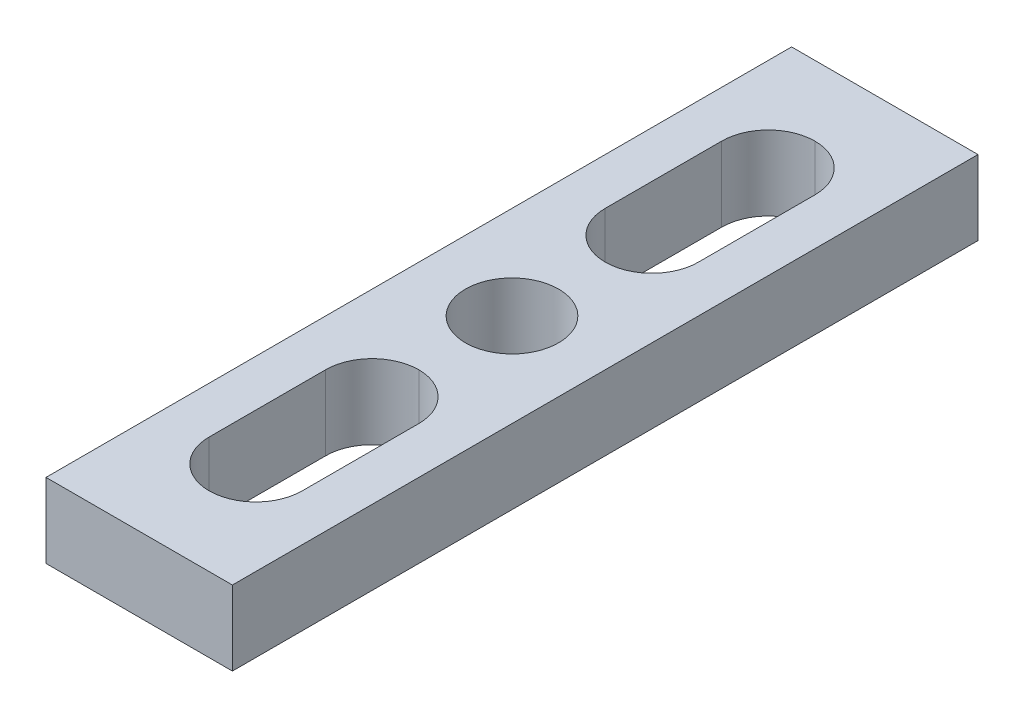
ISO-10303-21;
HEADER;
FILE_DESCRIPTION(('STEP AP214'),'2;1');
FILE_NAME('part.step','',(''),(''),'','','');
FILE_SCHEMA(('AUTOMOTIVE_DESIGN { 1 0 10303 214 1 1 1 1 }'));
ENDSEC;
DATA;
#1=APPLICATION_CONTEXT('core data for automotive mechanical design processes');
#2=APPLICATION_PROTOCOL_DEFINITION('international standard','automotive_design',2000,#1);
#3=PRODUCT_CONTEXT('',#1,'mechanical');
#4=PRODUCT('Part','Part','',(#3));
#5=PRODUCT_RELATED_PRODUCT_CATEGORY('part','',(#4));
#6=PRODUCT_DEFINITION_FORMATION('','',#4);
#7=PRODUCT_DEFINITION_CONTEXT('part definition',#1,'design');
#8=PRODUCT_DEFINITION('design','',#6,#7);
#9=PRODUCT_DEFINITION_SHAPE('','',#8);
#10=(LENGTH_UNIT() NAMED_UNIT(*) SI_UNIT(.MILLI.,.METRE.));
#11=(NAMED_UNIT(*) PLANE_ANGLE_UNIT() SI_UNIT($,.RADIAN.));
#12=(NAMED_UNIT(*) SI_UNIT($,.STERADIAN.) SOLID_ANGLE_UNIT());
#13=UNCERTAINTY_MEASURE_WITH_UNIT(LENGTH_MEASURE(1.E-05),#10,'distance_accuracy_value','');
#14=(GEOMETRIC_REPRESENTATION_CONTEXT(3) GLOBAL_UNCERTAINTY_ASSIGNED_CONTEXT((#13)) GLOBAL_UNIT_ASSIGNED_CONTEXT((#10,
#11,#12)) REPRESENTATION_CONTEXT('',''));
#15=CARTESIAN_POINT('',(0.,0.,0.));
#16=DIRECTION('',(0.,0.,1.));
#17=DIRECTION('',(1.,0.,0.));
#18=AXIS2_PLACEMENT_3D('',#15,#16,#17);
#19=CARTESIAN_POINT('',(-12.7,10.16,101.6));
#20=DIRECTION('',(1.,0.,0.));
#21=DIRECTION('',(0.,1.,0.));
#22=AXIS2_PLACEMENT_3D('',#19,#20,#21);
#23=PLANE('',#22);
#24=DIRECTION('',(0.,-1.,0.));
#25=VECTOR('',#24,1.);
#26=CARTESIAN_POINT('',(-12.7,10.16,0.));
#27=LINE('',#26,#25);
#28=CARTESIAN_POINT('',(-12.7,10.16,0.));
#29=VERTEX_POINT('',#28);
#30=CARTESIAN_POINT('',(-12.7,0.,0.));
#31=VERTEX_POINT('',#30);
#32=EDGE_CURVE('E182',#29,#31,#27,.T.);
#33=ORIENTED_EDGE('',*,*,#32,.T.);
#34=DIRECTION('',(0.,0.,-1.));
#35=VECTOR('',#34,1.);
#36=CARTESIAN_POINT('',(-12.7,0.,101.6));
#37=LINE('',#36,#35);
#38=CARTESIAN_POINT('',(-12.7,0.,101.6));
#39=VERTEX_POINT('',#38);
#40=EDGE_CURVE('E161',#39,#31,#37,.T.);
#41=ORIENTED_EDGE('',*,*,#40,.F.);
#42=DIRECTION('',(0.,-1.,0.));
#43=VECTOR('',#42,1.);
#44=CARTESIAN_POINT('',(-12.7,10.16,101.6));
#45=LINE('',#44,#43);
#46=CARTESIAN_POINT('',(-12.7,10.16,101.6));
#47=VERTEX_POINT('',#46);
#48=EDGE_CURVE('E169',#47,#39,#45,.T.);
#49=ORIENTED_EDGE('',*,*,#48,.F.);
#50=DIRECTION('',(0.,0.,-1.));
#51=VECTOR('',#50,1.);
#52=CARTESIAN_POINT('',(-12.7,10.16,101.6));
#53=LINE('',#52,#51);
#54=EDGE_CURVE('E333',#47,#29,#53,.T.);
#55=ORIENTED_EDGE('',*,*,#54,.T.);
#56=EDGE_LOOP('',(#33,#41,#49,#55));
#57=FACE_BOUND('',#56,.T.);
#58=ADVANCED_FACE('F41',(#57),#23,.F.);
#59=CARTESIAN_POINT('',(-12.7,0.,101.6));
#60=DIRECTION('',(0.,1.,0.));
#61=DIRECTION('',(0.,0.,1.));
#62=AXIS2_PLACEMENT_3D('',#59,#60,#61);
#63=PLANE('',#62);
#64=DIRECTION('',(0.,0.,-1.));
#65=VECTOR('',#64,1.);
#66=CARTESIAN_POINT('',(6.34999999999999,0.,101.6));
#67=LINE('',#66,#65);
#68=CARTESIAN_POINT('',(6.35,0.,31.75));
#69=VERTEX_POINT('',#68);
#70=CARTESIAN_POINT('',(6.35,0.,15.875));
#71=VERTEX_POINT('',#70);
#72=EDGE_CURVE('E314',#69,#71,#67,.T.);
#73=ORIENTED_EDGE('',*,*,#72,.T.);
#74=CARTESIAN_POINT('',(0.,0.,15.875));
#75=DIRECTION('',(0.,1.,0.));
#76=DIRECTION('',(0.,0.,1.));
#77=AXIS2_PLACEMENT_3D('',#74,#75,#76);
#78=CIRCLE('',#77,6.35);
#79=CARTESIAN_POINT('',(0.,0.,9.52500000000001));
#80=VERTEX_POINT('',#79);
#81=EDGE_CURVE('E59',#71,#80,#78,.T.);
#82=ORIENTED_EDGE('',*,*,#81,.T.);
#83=CARTESIAN_POINT('',(0.,0.,15.875));
#84=DIRECTION('',(0.,1.,0.));
#85=DIRECTION('',(0.,0.,1.));
#86=AXIS2_PLACEMENT_3D('',#83,#84,#85);
#87=CIRCLE('',#86,6.35);
#88=CARTESIAN_POINT('',(-6.35,0.,15.875));
#89=VERTEX_POINT('',#88);
#90=EDGE_CURVE('E238',#80,#89,#87,.T.);
#91=ORIENTED_EDGE('',*,*,#90,.T.);
#92=DIRECTION('',(0.,0.,1.));
#93=VECTOR('',#92,1.);
#94=CARTESIAN_POINT('',(-6.35000000000001,0.,101.6));
#95=LINE('',#94,#93);
#96=CARTESIAN_POINT('',(-6.35,0.,31.75));
#97=VERTEX_POINT('',#96);
#98=EDGE_CURVE('E317',#89,#97,#95,.T.);
#99=ORIENTED_EDGE('',*,*,#98,.T.);
#100=CARTESIAN_POINT('',(0.,0.,31.75));
#101=DIRECTION('',(0.,1.,0.));
#102=DIRECTION('',(0.,0.,1.));
#103=AXIS2_PLACEMENT_3D('',#100,#101,#102);
#104=CIRCLE('',#103,6.35);
#105=CARTESIAN_POINT('',(0.,0.,38.1));
#106=VERTEX_POINT('',#105);
#107=EDGE_CURVE('E227',#97,#106,#104,.T.);
#108=ORIENTED_EDGE('',*,*,#107,.T.);
#109=CARTESIAN_POINT('',(0.,0.,31.75));
#110=DIRECTION('',(0.,1.,0.));
#111=DIRECTION('',(0.,0.,1.));
#112=AXIS2_PLACEMENT_3D('',#109,#110,#111);
#113=CIRCLE('',#112,6.35);
#114=EDGE_CURVE('E11',#106,#69,#113,.T.);
#115=ORIENTED_EDGE('',*,*,#114,.T.);
#116=EDGE_LOOP('',(#73,#82,#91,#99,#108,#115));
#117=FACE_BOUND('',#116,.T.);
#118=CARTESIAN_POINT('',(0.,0.,85.725));
#119=DIRECTION('',(0.,1.,0.));
#120=DIRECTION('',(0.,0.,1.));
#121=AXIS2_PLACEMENT_3D('',#118,#119,#120);
#122=CIRCLE('',#121,6.35);
#123=CARTESIAN_POINT('',(-6.35,0.,85.725));
#124=VERTEX_POINT('',#123);
#125=CARTESIAN_POINT('',(0.,0.,92.075));
#126=VERTEX_POINT('',#125);
#127=EDGE_CURVE('E221',#124,#126,#122,.T.);
#128=ORIENTED_EDGE('',*,*,#127,.T.);
#129=CARTESIAN_POINT('',(0.,0.,85.725));
#130=DIRECTION('',(0.,1.,0.));
#131=DIRECTION('',(0.,0.,1.));
#132=AXIS2_PLACEMENT_3D('',#129,#130,#131);
#133=CIRCLE('',#132,6.35);
#134=CARTESIAN_POINT('',(6.35,0.,85.725));
#135=VERTEX_POINT('',#134);
#136=EDGE_CURVE('E255',#126,#135,#133,.T.);
#137=ORIENTED_EDGE('',*,*,#136,.T.);
#138=DIRECTION('',(0.,0.,-1.));
#139=VECTOR('',#138,1.);
#140=CARTESIAN_POINT('',(6.35,0.,101.6));
#141=LINE('',#140,#139);
#142=CARTESIAN_POINT('',(6.35,0.,69.85));
#143=VERTEX_POINT('',#142);
#144=EDGE_CURVE('E310',#135,#143,#141,.T.);
#145=ORIENTED_EDGE('',*,*,#144,.T.);
#146=CARTESIAN_POINT('',(0.,0.,69.85));
#147=DIRECTION('',(0.,1.,0.));
#148=DIRECTION('',(0.,0.,1.));
#149=AXIS2_PLACEMENT_3D('',#146,#147,#148);
#150=CIRCLE('',#149,6.35);
#151=CARTESIAN_POINT('',(0.,0.,63.5));
#152=VERTEX_POINT('',#151);
#153=EDGE_CURVE('E249',#143,#152,#150,.T.);
#154=ORIENTED_EDGE('',*,*,#153,.T.);
#155=CARTESIAN_POINT('',(0.,0.,69.85));
#156=DIRECTION('',(0.,1.,0.));
#157=DIRECTION('',(0.,0.,1.));
#158=AXIS2_PLACEMENT_3D('',#155,#156,#157);
#159=CIRCLE('',#158,6.35);
#160=CARTESIAN_POINT('',(-6.35,0.,69.85));
#161=VERTEX_POINT('',#160);
#162=EDGE_CURVE('E233',#152,#161,#159,.T.);
#163=ORIENTED_EDGE('',*,*,#162,.T.);
#164=DIRECTION('',(0.,0.,1.));
#165=VECTOR('',#164,1.);
#166=CARTESIAN_POINT('',(-6.35,0.,101.6));
#167=LINE('',#166,#165);
#168=EDGE_CURVE('E299',#161,#124,#167,.T.);
#169=ORIENTED_EDGE('',*,*,#168,.T.);
#170=EDGE_LOOP('',(#128,#137,#145,#154,#163,#169));
#171=FACE_BOUND('',#170,.T.);
#172=CARTESIAN_POINT('',(0.,0.,50.8));
#173=DIRECTION('',(0.,1.,0.));
#174=DIRECTION('',(0.,0.,1.));
#175=AXIS2_PLACEMENT_3D('',#172,#173,#174);
#176=CIRCLE('',#175,6.35);
#177=CARTESIAN_POINT('',(0.,0.,57.15));
#178=VERTEX_POINT('',#177);
#179=EDGE_CURVE('E325',#178,#178,#176,.T.);
#180=ORIENTED_EDGE('',*,*,#179,.T.);
#181=EDGE_LOOP('',(#180));
#182=FACE_BOUND('',#181,.T.);
#183=DIRECTION('',(1.,0.,0.));
#184=VECTOR('',#183,1.);
#185=CARTESIAN_POINT('',(-12.7,0.,0.));
#186=LINE('',#185,#184);
#187=CARTESIAN_POINT('',(12.7,0.,0.));
#188=VERTEX_POINT('',#187);
#189=EDGE_CURVE('E336',#31,#188,#186,.T.);
#190=ORIENTED_EDGE('',*,*,#189,.T.);
#191=DIRECTION('',(0.,0.,-1.));
#192=VECTOR('',#191,1.);
#193=CARTESIAN_POINT('',(12.7,0.,101.6));
#194=LINE('',#193,#192);
#195=CARTESIAN_POINT('',(12.7,0.,101.6));
#196=VERTEX_POINT('',#195);
#197=EDGE_CURVE('E164',#196,#188,#194,.T.);
#198=ORIENTED_EDGE('',*,*,#197,.F.);
#199=DIRECTION('',(1.,0.,0.));
#200=VECTOR('',#199,1.);
#201=CARTESIAN_POINT('',(-12.7,0.,101.6));
#202=LINE('',#201,#200);
#203=EDGE_CURVE('E157',#39,#196,#202,.T.);
#204=ORIENTED_EDGE('',*,*,#203,.F.);
#205=ORIENTED_EDGE('',*,*,#40,.T.);
#206=EDGE_LOOP('',(#190,#198,#204,#205));
#207=FACE_BOUND('',#206,.T.);
#208=ADVANCED_FACE('F159',(#117,#171,#182,#207),#63,.F.);
#209=CARTESIAN_POINT('',(12.7,10.16,101.6));
#210=DIRECTION('',(-1.,0.,0.));
#211=DIRECTION('',(0.,-1.,0.));
#212=AXIS2_PLACEMENT_3D('',#209,#210,#211);
#213=PLANE('',#212);
#214=DIRECTION('',(0.,1.,0.));
#215=VECTOR('',#214,1.);
#216=CARTESIAN_POINT('',(12.7,10.16,0.));
#217=LINE('',#216,#215);
#218=CARTESIAN_POINT('',(12.7,10.16,0.));
#219=VERTEX_POINT('',#218);
#220=EDGE_CURVE('E339',#188,#219,#217,.T.);
#221=ORIENTED_EDGE('',*,*,#220,.T.);
#222=DIRECTION('',(0.,0.,-1.));
#223=VECTOR('',#222,1.);
#224=CARTESIAN_POINT('',(12.7,10.16,101.6));
#225=LINE('',#224,#223);
#226=CARTESIAN_POINT('',(12.7,10.16,101.6));
#227=VERTEX_POINT('',#226);
#228=EDGE_CURVE('E191',#227,#219,#225,.T.);
#229=ORIENTED_EDGE('',*,*,#228,.F.);
#230=DIRECTION('',(0.,1.,0.));
#231=VECTOR('',#230,1.);
#232=CARTESIAN_POINT('',(12.7,10.16,101.6));
#233=LINE('',#232,#231);
#234=EDGE_CURVE('E168',#196,#227,#233,.T.);
#235=ORIENTED_EDGE('',*,*,#234,.F.);
#236=ORIENTED_EDGE('',*,*,#197,.T.);
#237=EDGE_LOOP('',(#221,#229,#235,#236));
#238=FACE_BOUND('',#237,.T.);
#239=ADVANCED_FACE('F354',(#238),#213,.F.);
#240=CARTESIAN_POINT('',(-12.7,10.16,101.6));
#241=DIRECTION('',(0.,-1.,0.));
#242=DIRECTION('',(1.,0.,0.));
#243=AXIS2_PLACEMENT_3D('',#240,#241,#242);
#244=PLANE('',#243);
#245=DIRECTION('',(0.,0.,-1.));
#246=VECTOR('',#245,1.);
#247=CARTESIAN_POINT('',(6.35,10.16,38.1));
#248=LINE('',#247,#246);
#249=CARTESIAN_POINT('',(6.35,10.16,31.75));
#250=VERTEX_POINT('',#249);
#251=CARTESIAN_POINT('',(6.35,10.16,15.875));
#252=VERTEX_POINT('',#251);
#253=EDGE_CURVE('E286',#250,#252,#248,.T.);
#254=ORIENTED_EDGE('',*,*,#253,.F.);
#255=CARTESIAN_POINT('',(0.,10.16,31.75));
#256=DIRECTION('',(0.,-1.,0.));
#257=DIRECTION('',(1.,0.,0.));
#258=AXIS2_PLACEMENT_3D('',#255,#256,#257);
#259=CIRCLE('',#258,6.35);
#260=CARTESIAN_POINT('',(0.,10.16,38.1));
#261=VERTEX_POINT('',#260);
#262=EDGE_CURVE('E51',#250,#261,#259,.T.);
#263=ORIENTED_EDGE('',*,*,#262,.T.);
#264=CARTESIAN_POINT('',(0.,10.16,31.75));
#265=DIRECTION('',(0.,-1.,0.));
#266=DIRECTION('',(1.,0.,0.));
#267=AXIS2_PLACEMENT_3D('',#264,#265,#266);
#268=CIRCLE('',#267,6.35);
#269=CARTESIAN_POINT('',(-6.35,10.16,31.75));
#270=VERTEX_POINT('',#269);
#271=EDGE_CURVE('E224',#261,#270,#268,.T.);
#272=ORIENTED_EDGE('',*,*,#271,.T.);
#273=DIRECTION('',(0.,0.,1.));
#274=VECTOR('',#273,1.);
#275=CARTESIAN_POINT('',(-6.35,10.16,38.1));
#276=LINE('',#275,#274);
#277=CARTESIAN_POINT('',(-6.35,10.16,15.875));
#278=VERTEX_POINT('',#277);
#279=EDGE_CURVE('E293',#278,#270,#276,.T.);
#280=ORIENTED_EDGE('',*,*,#279,.F.);
#281=CARTESIAN_POINT('',(0.,10.16,15.875));
#282=DIRECTION('',(0.,-1.,0.));
#283=DIRECTION('',(1.,0.,0.));
#284=AXIS2_PLACEMENT_3D('',#281,#282,#283);
#285=CIRCLE('',#284,6.35);
#286=CARTESIAN_POINT('',(0.,10.16,9.52500000000001));
#287=VERTEX_POINT('',#286);
#288=EDGE_CURVE('E67',#278,#287,#285,.T.);
#289=ORIENTED_EDGE('',*,*,#288,.T.);
#290=CARTESIAN_POINT('',(0.,10.16,15.875));
#291=DIRECTION('',(0.,-1.,0.));
#292=DIRECTION('',(1.,0.,0.));
#293=AXIS2_PLACEMENT_3D('',#290,#291,#292);
#294=CIRCLE('',#293,6.35);
#295=EDGE_CURVE('E241',#287,#252,#294,.T.);
#296=ORIENTED_EDGE('',*,*,#295,.T.);
#297=EDGE_LOOP('',(#254,#263,#272,#280,#289,#296));
#298=FACE_BOUND('',#297,.T.);
#299=CARTESIAN_POINT('',(0.,10.16,69.85));
#300=DIRECTION('',(0.,-1.,0.));
#301=DIRECTION('',(1.,0.,0.));
#302=AXIS2_PLACEMENT_3D('',#299,#300,#301);
#303=CIRCLE('',#302,6.35);
#304=CARTESIAN_POINT('',(-6.35,10.16,69.85));
#305=VERTEX_POINT('',#304);
#306=CARTESIAN_POINT('',(0.,10.16,63.5));
#307=VERTEX_POINT('',#306);
#308=EDGE_CURVE('E230',#305,#307,#303,.T.);
#309=ORIENTED_EDGE('',*,*,#308,.T.);
#310=CARTESIAN_POINT('',(0.,10.16,69.85));
#311=DIRECTION('',(0.,-1.,0.));
#312=DIRECTION('',(1.,0.,0.));
#313=AXIS2_PLACEMENT_3D('',#310,#311,#312);
#314=CIRCLE('',#313,6.35);
#315=CARTESIAN_POINT('',(6.35,10.16,69.85));
#316=VERTEX_POINT('',#315);
#317=EDGE_CURVE('E246',#307,#316,#314,.T.);
#318=ORIENTED_EDGE('',*,*,#317,.T.);
#319=DIRECTION('',(0.,0.,-1.));
#320=VECTOR('',#319,1.);
#321=CARTESIAN_POINT('',(6.35,10.16,63.5));
#322=LINE('',#321,#320);
#323=CARTESIAN_POINT('',(6.35,10.16,85.725));
#324=VERTEX_POINT('',#323);
#325=EDGE_CURVE('E264',#324,#316,#322,.T.);
#326=ORIENTED_EDGE('',*,*,#325,.F.);
#327=CARTESIAN_POINT('',(0.,10.16,85.725));
#328=DIRECTION('',(0.,-1.,0.));
#329=DIRECTION('',(1.,0.,0.));
#330=AXIS2_PLACEMENT_3D('',#327,#328,#329);
#331=CIRCLE('',#330,6.35);
#332=CARTESIAN_POINT('',(0.,10.16,92.075));
#333=VERTEX_POINT('',#332);
#334=EDGE_CURVE('E252',#324,#333,#331,.T.);
#335=ORIENTED_EDGE('',*,*,#334,.T.);
#336=CARTESIAN_POINT('',(0.,10.16,85.725));
#337=DIRECTION('',(0.,-1.,0.));
#338=DIRECTION('',(1.,0.,0.));
#339=AXIS2_PLACEMENT_3D('',#336,#337,#338);
#340=CIRCLE('',#339,6.35);
#341=CARTESIAN_POINT('',(-6.35,10.16,85.725));
#342=VERTEX_POINT('',#341);
#343=EDGE_CURVE('E218',#333,#342,#340,.T.);
#344=ORIENTED_EDGE('',*,*,#343,.T.);
#345=DIRECTION('',(0.,0.,1.));
#346=VECTOR('',#345,1.);
#347=CARTESIAN_POINT('',(-6.35,10.16,63.5));
#348=LINE('',#347,#346);
#349=EDGE_CURVE('E294',#305,#342,#348,.T.);
#350=ORIENTED_EDGE('',*,*,#349,.F.);
#351=EDGE_LOOP('',(#309,#318,#326,#335,#344,#350));
#352=FACE_BOUND('',#351,.T.);
#353=CARTESIAN_POINT('',(0.,10.16,50.8));
#354=DIRECTION('',(0.,1.,0.));
#355=DIRECTION('',(-1.,0.,0.));
#356=AXIS2_PLACEMENT_3D('',#353,#354,#355);
#357=CIRCLE('',#356,6.35);
#358=CARTESIAN_POINT('',(-6.35,10.16,50.8));
#359=VERTEX_POINT('',#358);
#360=EDGE_CURVE('E321',#359,#359,#357,.T.);
#361=ORIENTED_EDGE('',*,*,#360,.F.);
#362=EDGE_LOOP('',(#361));
#363=FACE_BOUND('',#362,.T.);
#364=DIRECTION('',(-1.,0.,0.));
#365=VECTOR('',#364,1.);
#366=CARTESIAN_POINT('',(-12.7,10.16,0.));
#367=LINE('',#366,#365);
#368=EDGE_CURVE('E179',#219,#29,#367,.T.);
#369=ORIENTED_EDGE('',*,*,#368,.T.);
#370=ORIENTED_EDGE('',*,*,#54,.F.);
#371=DIRECTION('',(-1.,0.,0.));
#372=VECTOR('',#371,1.);
#373=CARTESIAN_POINT('',(-12.7,10.16,101.6));
#374=LINE('',#373,#372);
#375=EDGE_CURVE('E174',#227,#47,#374,.T.);
#376=ORIENTED_EDGE('',*,*,#375,.F.);
#377=ORIENTED_EDGE('',*,*,#228,.T.);
#378=EDGE_LOOP('',(#369,#370,#376,#377));
#379=FACE_BOUND('',#378,.T.);
#380=ADVANCED_FACE('F284',(#298,#352,#363,#379),#244,.F.);
#381=CARTESIAN_POINT('',(0.,0.,101.6));
#382=DIRECTION('',(0.,0.,1.));
#383=DIRECTION('',(1.,0.,0.));
#384=AXIS2_PLACEMENT_3D('',#381,#382,#383);
#385=PLANE('',#384);
#386=ORIENTED_EDGE('',*,*,#48,.T.);
#387=ORIENTED_EDGE('',*,*,#203,.T.);
#388=ORIENTED_EDGE('',*,*,#234,.T.);
#389=ORIENTED_EDGE('',*,*,#375,.T.);
#390=EDGE_LOOP('',(#386,#387,#388,#389));
#391=FACE_BOUND('',#390,.T.);
#392=ADVANCED_FACE('F172',(#391),#385,.T.);
#393=CARTESIAN_POINT('',(0.,0.,0.));
#394=DIRECTION('',(0.,0.,1.));
#395=DIRECTION('',(1.,0.,0.));
#396=AXIS2_PLACEMENT_3D('',#393,#394,#395);
#397=PLANE('',#396);
#398=ORIENTED_EDGE('',*,*,#32,.F.);
#399=ORIENTED_EDGE('',*,*,#368,.F.);
#400=ORIENTED_EDGE('',*,*,#220,.F.);
#401=ORIENTED_EDGE('',*,*,#189,.F.);
#402=EDGE_LOOP('',(#398,#399,#400,#401));
#403=FACE_BOUND('',#402,.T.);
#404=ADVANCED_FACE('F353',(#403),#397,.F.);
#405=CARTESIAN_POINT('',(0.,-78.74,50.8));
#406=DIRECTION('',(0.,1.,0.));
#407=DIRECTION('',(-1.,0.,0.));
#408=AXIS2_PLACEMENT_3D('',#405,#406,#407);
#409=CYLINDRICAL_SURFACE('',#408,6.35);
#410=ORIENTED_EDGE('',*,*,#360,.T.);
#411=EDGE_LOOP('',(#410));
#412=FACE_BOUND('',#411,.T.);
#413=ORIENTED_EDGE('',*,*,#179,.F.);
#414=EDGE_LOOP('',(#413));
#415=FACE_BOUND('',#414,.T.);
#416=ADVANCED_FACE('F449',(#412,#415),#409,.F.);
#417=CARTESIAN_POINT('',(6.35,-5.715,63.5));
#418=DIRECTION('',(1.,0.,0.));
#419=DIRECTION('',(0.,0.,-1.));
#420=AXIS2_PLACEMENT_3D('',#417,#418,#419);
#421=PLANE('',#420);
#422=ORIENTED_EDGE('',*,*,#325,.T.);
#423=DIRECTION('',(0.,1.,0.));
#424=VECTOR('',#423,1.);
#425=CARTESIAN_POINT('',(6.35,0.,69.85));
#426=LINE('',#425,#424);
#427=EDGE_CURVE('E215',#316,#143,#426,.F.);
#428=ORIENTED_EDGE('',*,*,#427,.T.);
#429=ORIENTED_EDGE('',*,*,#144,.F.);
#430=DIRECTION('',(0.,1.,0.));
#431=VECTOR('',#430,1.);
#432=CARTESIAN_POINT('',(6.35,10.16,85.725));
#433=LINE('',#432,#431);
#434=EDGE_CURVE('E212',#135,#324,#433,.T.);
#435=ORIENTED_EDGE('',*,*,#434,.T.);
#436=EDGE_LOOP('',(#422,#428,#429,#435));
#437=FACE_BOUND('',#436,.T.);
#438=ADVANCED_FACE('F441',(#437),#421,.F.);
#439=CARTESIAN_POINT('',(-6.35,-5.715,63.5));
#440=DIRECTION('',(-1.,0.,0.));
#441=DIRECTION('',(0.,0.,1.));
#442=AXIS2_PLACEMENT_3D('',#439,#440,#441);
#443=PLANE('',#442);
#444=ORIENTED_EDGE('',*,*,#349,.T.);
#445=DIRECTION('',(0.,1.,0.));
#446=VECTOR('',#445,1.);
#447=CARTESIAN_POINT('',(-6.35,0.,85.725));
#448=LINE('',#447,#446);
#449=EDGE_CURVE('E189',#342,#124,#448,.F.);
#450=ORIENTED_EDGE('',*,*,#449,.T.);
#451=ORIENTED_EDGE('',*,*,#168,.F.);
#452=DIRECTION('',(0.,1.,0.));
#453=VECTOR('',#452,1.);
#454=CARTESIAN_POINT('',(-6.35,10.16,69.85));
#455=LINE('',#454,#453);
#456=EDGE_CURVE('E184',#161,#305,#455,.T.);
#457=ORIENTED_EDGE('',*,*,#456,.T.);
#458=EDGE_LOOP('',(#444,#450,#451,#457));
#459=FACE_BOUND('',#458,.T.);
#460=ADVANCED_FACE('F433',(#459),#443,.F.);
#461=CARTESIAN_POINT('',(-6.35,-5.715,38.1));
#462=DIRECTION('',(-1.,0.,0.));
#463=DIRECTION('',(0.,0.,1.));
#464=AXIS2_PLACEMENT_3D('',#461,#462,#463);
#465=PLANE('',#464);
#466=ORIENTED_EDGE('',*,*,#279,.T.);
#467=DIRECTION('',(0.,1.,0.));
#468=VECTOR('',#467,1.);
#469=CARTESIAN_POINT('',(-6.35,0.,31.75));
#470=LINE('',#469,#468);
#471=EDGE_CURVE('E202',#270,#97,#470,.F.);
#472=ORIENTED_EDGE('',*,*,#471,.T.);
#473=ORIENTED_EDGE('',*,*,#98,.F.);
#474=DIRECTION('',(0.,1.,0.));
#475=VECTOR('',#474,1.);
#476=CARTESIAN_POINT('',(-6.35,10.16,15.875));
#477=LINE('',#476,#475);
#478=EDGE_CURVE('E198',#89,#278,#477,.T.);
#479=ORIENTED_EDGE('',*,*,#478,.T.);
#480=EDGE_LOOP('',(#466,#472,#473,#479));
#481=FACE_BOUND('',#480,.T.);
#482=ADVANCED_FACE('F426',(#481),#465,.F.);
#483=CARTESIAN_POINT('',(6.35,-5.715,38.1));
#484=DIRECTION('',(1.,0.,0.));
#485=DIRECTION('',(0.,0.,-1.));
#486=AXIS2_PLACEMENT_3D('',#483,#484,#485);
#487=PLANE('',#486);
#488=ORIENTED_EDGE('',*,*,#253,.T.);
#489=DIRECTION('',(0.,1.,0.));
#490=VECTOR('',#489,1.);
#491=CARTESIAN_POINT('',(6.35,0.,15.875));
#492=LINE('',#491,#490);
#493=EDGE_CURVE('E209',#252,#71,#492,.F.);
#494=ORIENTED_EDGE('',*,*,#493,.T.);
#495=ORIENTED_EDGE('',*,*,#72,.F.);
#496=DIRECTION('',(0.,1.,0.));
#497=VECTOR('',#496,1.);
#498=CARTESIAN_POINT('',(6.35,10.16,31.75));
#499=LINE('',#498,#497);
#500=EDGE_CURVE('E206',#69,#250,#499,.T.);
#501=ORIENTED_EDGE('',*,*,#500,.T.);
#502=EDGE_LOOP('',(#488,#494,#495,#501));
#503=FACE_BOUND('',#502,.T.);
#504=ADVANCED_FACE('F289',(#503),#487,.F.);
#505=CARTESIAN_POINT('',(0.,-5.715,85.725));
#506=DIRECTION('',(0.,-1.,0.));
#507=DIRECTION('',(1.,0.,0.));
#508=AXIS2_PLACEMENT_3D('',#505,#506,#507);
#509=CYLINDRICAL_SURFACE('',#508,6.35);
#510=ORIENTED_EDGE('',*,*,#434,.F.);
#511=ORIENTED_EDGE('',*,*,#136,.F.);
#512=DIRECTION('',(0.,1.,0.));
#513=VECTOR('',#512,1.);
#514=CARTESIAN_POINT('',(0.,0.,92.075));
#515=LINE('',#514,#513);
#516=EDGE_CURVE('E260',#333,#126,#515,.F.);
#517=ORIENTED_EDGE('',*,*,#516,.F.);
#518=ORIENTED_EDGE('',*,*,#334,.F.);
#519=EDGE_LOOP('',(#510,#511,#517,#518));
#520=FACE_BOUND('',#519,.T.);
#521=ADVANCED_FACE('F372',(#520),#509,.F.);
#522=CARTESIAN_POINT('',(0.,-5.715,85.725));
#523=DIRECTION('',(0.,-1.,0.));
#524=DIRECTION('',(1.,0.,0.));
#525=AXIS2_PLACEMENT_3D('',#522,#523,#524);
#526=CYLINDRICAL_SURFACE('',#525,6.35);
#527=ORIENTED_EDGE('',*,*,#127,.F.);
#528=ORIENTED_EDGE('',*,*,#449,.F.);
#529=ORIENTED_EDGE('',*,*,#343,.F.);
#530=ORIENTED_EDGE('',*,*,#516,.T.);
#531=EDGE_LOOP('',(#527,#528,#529,#530));
#532=FACE_BOUND('',#531,.T.);
#533=ADVANCED_FACE('F368',(#532),#526,.F.);
#534=CARTESIAN_POINT('',(0.,-5.715,31.75));
#535=DIRECTION('',(0.,-1.,0.));
#536=DIRECTION('',(1.,0.,0.));
#537=AXIS2_PLACEMENT_3D('',#534,#535,#536);
#538=CYLINDRICAL_SURFACE('',#537,6.35);
#539=ORIENTED_EDGE('',*,*,#500,.F.);
#540=ORIENTED_EDGE('',*,*,#114,.F.);
#541=DIRECTION('',(0.,1.,0.));
#542=VECTOR('',#541,1.);
#543=CARTESIAN_POINT('',(0.,0.,38.1));
#544=LINE('',#543,#542);
#545=EDGE_CURVE('E265',#261,#106,#544,.F.);
#546=ORIENTED_EDGE('',*,*,#545,.F.);
#547=ORIENTED_EDGE('',*,*,#262,.F.);
#548=EDGE_LOOP('',(#539,#540,#546,#547));
#549=FACE_BOUND('',#548,.T.);
#550=ADVANCED_FACE('F371',(#549),#538,.F.);
#551=CARTESIAN_POINT('',(0.,-5.715,31.75));
#552=DIRECTION('',(0.,-1.,0.));
#553=DIRECTION('',(1.,0.,0.));
#554=AXIS2_PLACEMENT_3D('',#551,#552,#553);
#555=CYLINDRICAL_SURFACE('',#554,6.35);
#556=ORIENTED_EDGE('',*,*,#107,.F.);
#557=ORIENTED_EDGE('',*,*,#471,.F.);
#558=ORIENTED_EDGE('',*,*,#271,.F.);
#559=ORIENTED_EDGE('',*,*,#545,.T.);
#560=EDGE_LOOP('',(#556,#557,#558,#559));
#561=FACE_BOUND('',#560,.T.);
#562=ADVANCED_FACE('F377',(#561),#555,.F.);
#563=CARTESIAN_POINT('',(0.,-5.715,69.85));
#564=DIRECTION('',(0.,-1.,0.));
#565=DIRECTION('',(1.,0.,0.));
#566=AXIS2_PLACEMENT_3D('',#563,#564,#565);
#567=CYLINDRICAL_SURFACE('',#566,6.35);
#568=DIRECTION('',(0.,1.,0.));
#569=VECTOR('',#568,1.);
#570=CARTESIAN_POINT('',(0.,10.16,63.5));
#571=LINE('',#570,#569);
#572=EDGE_CURVE('E268',#152,#307,#571,.T.);
#573=ORIENTED_EDGE('',*,*,#572,.F.);
#574=ORIENTED_EDGE('',*,*,#153,.F.);
#575=ORIENTED_EDGE('',*,*,#427,.F.);
#576=ORIENTED_EDGE('',*,*,#317,.F.);
#577=EDGE_LOOP('',(#573,#574,#575,#576));
#578=FACE_BOUND('',#577,.T.);
#579=ADVANCED_FACE('F380',(#578),#567,.F.);
#580=CARTESIAN_POINT('',(0.,-5.715,69.85));
#581=DIRECTION('',(0.,-1.,0.));
#582=DIRECTION('',(1.,0.,0.));
#583=AXIS2_PLACEMENT_3D('',#580,#581,#582);
#584=CYLINDRICAL_SURFACE('',#583,6.35);
#585=ORIENTED_EDGE('',*,*,#162,.F.);
#586=ORIENTED_EDGE('',*,*,#572,.T.);
#587=ORIENTED_EDGE('',*,*,#308,.F.);
#588=ORIENTED_EDGE('',*,*,#456,.F.);
#589=EDGE_LOOP('',(#585,#586,#587,#588));
#590=FACE_BOUND('',#589,.T.);
#591=ADVANCED_FACE('F385',(#590),#584,.F.);
#592=CARTESIAN_POINT('',(0.,-5.715,15.875));
#593=DIRECTION('',(0.,-1.,0.));
#594=DIRECTION('',(1.,0.,0.));
#595=AXIS2_PLACEMENT_3D('',#592,#593,#594);
#596=CYLINDRICAL_SURFACE('',#595,6.35);
#597=DIRECTION('',(0.,1.,0.));
#598=VECTOR('',#597,1.);
#599=CARTESIAN_POINT('',(0.,10.16,9.52500000000001));
#600=LINE('',#599,#598);
#601=EDGE_CURVE('E45',#80,#287,#600,.T.);
#602=ORIENTED_EDGE('',*,*,#601,.F.);
#603=ORIENTED_EDGE('',*,*,#81,.F.);
#604=ORIENTED_EDGE('',*,*,#493,.F.);
#605=ORIENTED_EDGE('',*,*,#295,.F.);
#606=EDGE_LOOP('',(#602,#603,#604,#605));
#607=FACE_BOUND('',#606,.T.);
#608=ADVANCED_FACE('F43',(#607),#596,.F.);
#609=CARTESIAN_POINT('',(0.,-5.715,15.875));
#610=DIRECTION('',(0.,-1.,0.));
#611=DIRECTION('',(1.,0.,0.));
#612=AXIS2_PLACEMENT_3D('',#609,#610,#611);
#613=CYLINDRICAL_SURFACE('',#612,6.35);
#614=ORIENTED_EDGE('',*,*,#90,.F.);
#615=ORIENTED_EDGE('',*,*,#601,.T.);
#616=ORIENTED_EDGE('',*,*,#288,.F.);
#617=ORIENTED_EDGE('',*,*,#478,.F.);
#618=EDGE_LOOP('',(#614,#615,#616,#617));
#619=FACE_BOUND('',#618,.T.);
#620=ADVANCED_FACE('F278',(#619),#613,.F.);
#621=CLOSED_SHELL('',(#58,#208,#239,#380,#392,#404,#416,#438,#460,#482,#504,#521,#533,#550,#562,
#579,#591,#608,#620));
#622=MANIFOLD_SOLID_BREP('B2',#621);
#623=ADVANCED_BREP_SHAPE_REPRESENTATION('',(#18,#622),#14);
#624=SHAPE_DEFINITION_REPRESENTATION(#9,#623);
ENDSEC;
END-ISO-10303-21;
